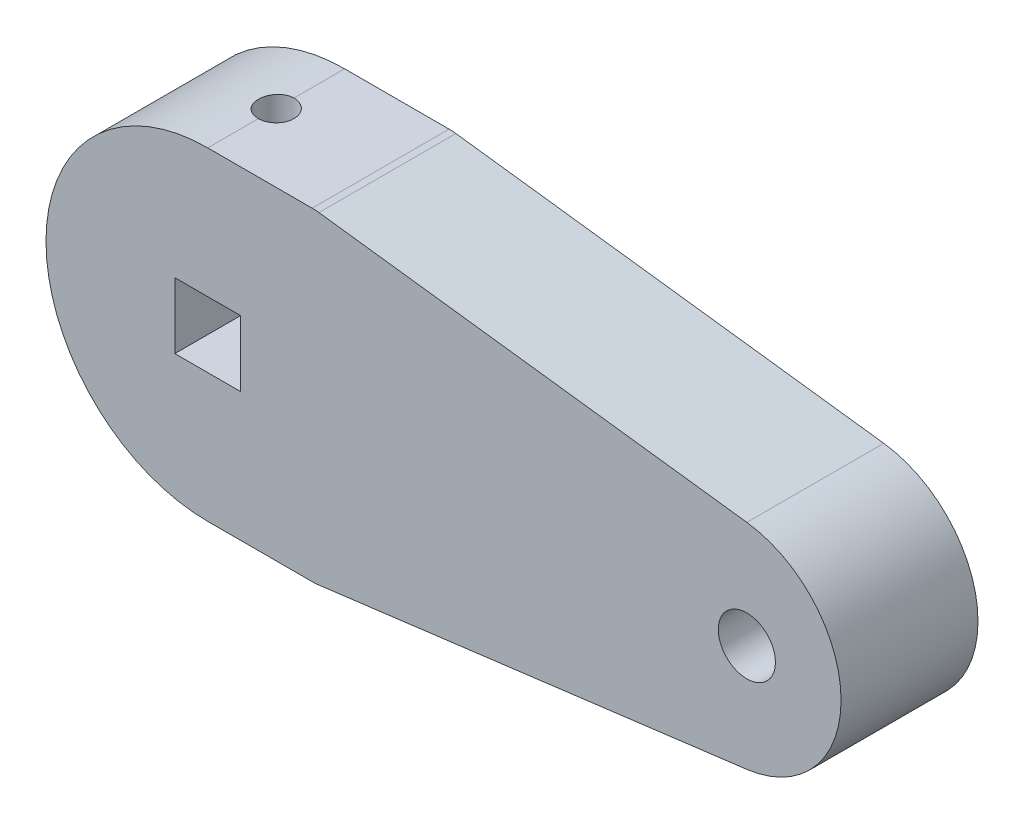
ISO-10303-21;
HEADER;
FILE_DESCRIPTION(('STEP AP214'),'2;1');
FILE_NAME('part.step','',(''),(''),'','','');
FILE_SCHEMA(('AUTOMOTIVE_DESIGN { 1 0 10303 214 1 1 1 1 }'));
ENDSEC;
DATA;
#1=APPLICATION_CONTEXT('core data for automotive mechanical design processes');
#2=APPLICATION_PROTOCOL_DEFINITION('international standard','automotive_design',2000,#1);
#3=PRODUCT_CONTEXT('',#1,'mechanical');
#4=PRODUCT('Part','Part','',(#3));
#5=PRODUCT_RELATED_PRODUCT_CATEGORY('part','',(#4));
#6=PRODUCT_DEFINITION_FORMATION('','',#4);
#7=PRODUCT_DEFINITION_CONTEXT('part definition',#1,'design');
#8=PRODUCT_DEFINITION('design','',#6,#7);
#9=PRODUCT_DEFINITION_SHAPE('','',#8);
#10=(LENGTH_UNIT() NAMED_UNIT(*) SI_UNIT(.MILLI.,.METRE.));
#11=(NAMED_UNIT(*) PLANE_ANGLE_UNIT() SI_UNIT($,.RADIAN.));
#12=(NAMED_UNIT(*) SI_UNIT($,.STERADIAN.) SOLID_ANGLE_UNIT());
#13=UNCERTAINTY_MEASURE_WITH_UNIT(LENGTH_MEASURE(1.E-05),#10,'distance_accuracy_value','');
#14=(GEOMETRIC_REPRESENTATION_CONTEXT(3) GLOBAL_UNCERTAINTY_ASSIGNED_CONTEXT((#13)) GLOBAL_UNIT_ASSIGNED_CONTEXT((#10,
#11,#12)) REPRESENTATION_CONTEXT('',''));
#15=CARTESIAN_POINT('',(0.,0.,0.));
#16=DIRECTION('',(0.,0.,1.));
#17=DIRECTION('',(1.,0.,0.));
#18=AXIS2_PLACEMENT_3D('',#15,#16,#17);
#19=CARTESIAN_POINT('',(10.,15.,12.7));
#20=DIRECTION('',(0.,-1.,0.));
#21=DIRECTION('',(0.,0.,-1.));
#22=AXIS2_PLACEMENT_3D('',#19,#20,#21);
#23=PLANE('',#22);
#24=DIRECTION('',(-1.,0.,0.));
#25=VECTOR('',#24,1.);
#26=CARTESIAN_POINT('',(10.,15.,12.7));
#27=LINE('',#26,#25);
#28=CARTESIAN_POINT('',(9.68379025906273,15.,12.7));
#29=VERTEX_POINT('',#28);
#30=CARTESIAN_POINT('',(0.,15.,12.7));
#31=VERTEX_POINT('',#30);
#32=EDGE_CURVE('E193',#29,#31,#27,.T.);
#33=ORIENTED_EDGE('',*,*,#32,.F.);
#34=DIRECTION('',(0.,0.,-1.));
#35=VECTOR('',#34,1.);
#36=CARTESIAN_POINT('',(9.68379025906273,15.,12.7));
#37=LINE('',#36,#35);
#38=CARTESIAN_POINT('',(9.68379025906273,15.,0.));
#39=VERTEX_POINT('',#38);
#40=EDGE_CURVE('E47',#29,#39,#37,.T.);
#41=ORIENTED_EDGE('',*,*,#40,.T.);
#42=DIRECTION('',(-1.,0.,0.));
#43=VECTOR('',#42,1.);
#44=CARTESIAN_POINT('',(10.,15.,0.));
#45=LINE('',#44,#43);
#46=CARTESIAN_POINT('',(0.,15.,0.));
#47=VERTEX_POINT('',#46);
#48=EDGE_CURVE('E192',#39,#47,#45,.T.);
#49=ORIENTED_EDGE('',*,*,#48,.T.);
#50=DIRECTION('',(0.,0.,-1.));
#51=VECTOR('',#50,1.);
#52=CARTESIAN_POINT('',(0.,15.,12.7));
#53=LINE('',#52,#51);
#54=CARTESIAN_POINT('',(0.,15.,4.7));
#55=VERTEX_POINT('',#54);
#56=EDGE_CURVE('E149',#55,#47,#53,.T.);
#57=ORIENTED_EDGE('',*,*,#56,.F.);
#58=CARTESIAN_POINT('',(0.,15.,6.35));
#59=DIRECTION('',(0.,1.,0.));
#60=DIRECTION('',(0.,0.,1.));
#61=AXIS2_PLACEMENT_3D('',#58,#59,#60);
#62=CIRCLE('',#61,1.65);
#63=CARTESIAN_POINT('',(0.,15.,8.));
#64=VERTEX_POINT('',#63);
#65=EDGE_CURVE('E136',#64,#55,#62,.T.);
#66=ORIENTED_EDGE('',*,*,#65,.F.);
#67=EDGE_CURVE('E147',#31,#64,#53,.T.);
#68=ORIENTED_EDGE('',*,*,#67,.F.);
#69=EDGE_LOOP('',(#33,#41,#49,#57,#66,#68));
#70=FACE_BOUND('',#69,.T.);
#71=ADVANCED_FACE('F38',(#70),#23,.F.);
#72=CARTESIAN_POINT('',(0.,0.,12.7));
#73=DIRECTION('',(0.,0.,1.));
#74=DIRECTION('',(1.,0.,0.));
#75=AXIS2_PLACEMENT_3D('',#72,#73,#74);
#76=PLANE('',#75);
#77=CARTESIAN_POINT('',(50.,0.,12.7));
#78=DIRECTION('',(0.,0.,1.));
#79=DIRECTION('',(1.,0.,0.));
#80=AXIS2_PLACEMENT_3D('',#77,#78,#79);
#81=CIRCLE('',#80,2.65);
#82=CARTESIAN_POINT('',(52.65,0.,12.7));
#83=VERTEX_POINT('',#82);
#84=EDGE_CURVE('E151',#83,#83,#81,.T.);
#85=ORIENTED_EDGE('',*,*,#84,.F.);
#86=EDGE_LOOP('',(#85));
#87=FACE_BOUND('',#86,.T.);
#88=DIRECTION('',(1.,0.,0.));
#89=VECTOR('',#88,1.);
#90=CARTESIAN_POINT('',(10.,-15.,12.7));
#91=LINE('',#90,#89);
#92=CARTESIAN_POINT('',(0.,-15.,12.7));
#93=VERTEX_POINT('',#92);
#94=CARTESIAN_POINT('',(9.68379025906273,-15.,12.7));
#95=VERTEX_POINT('',#94);
#96=EDGE_CURVE('E208',#93,#95,#91,.T.);
#97=ORIENTED_EDGE('',*,*,#96,.T.);
#98=CARTESIAN_POINT('',(9.68379025906273,-10.,12.7));
#99=DIRECTION('',(0.,0.,1.));
#100=DIRECTION('',(1.,0.,0.));
#101=AXIS2_PLACEMENT_3D('',#98,#99,#100);
#102=CIRCLE('',#101,5.);
#103=CARTESIAN_POINT('',(10.3136904274914,-14.960163886185,12.7));
#104=VERTEX_POINT('',#103);
#105=EDGE_CURVE('E186',#95,#104,#102,.T.);
#106=ORIENTED_EDGE('',*,*,#105,.T.);
#107=DIRECTION('',(0.992032777236993,0.125980033685737,0.));
#108=VECTOR('',#107,1.);
#109=CARTESIAN_POINT('',(10.,-15.,12.7));
#110=LINE('',#109,#108);
#111=CARTESIAN_POINT('',(50.,-9.92032777236993,12.7));
#112=VERTEX_POINT('',#111);
#113=EDGE_CURVE('E232',#104,#112,#110,.T.);
#114=ORIENTED_EDGE('',*,*,#113,.T.);
#115=CARTESIAN_POINT('',(48.7401996631426,0.,12.7));
#116=DIRECTION('',(0.,0.,1.));
#117=DIRECTION('',(-1.,0.,0.));
#118=AXIS2_PLACEMENT_3D('',#115,#116,#117);
#119=CIRCLE('',#118,10.);
#120=CARTESIAN_POINT('',(50.,9.92032777236993,12.7));
#121=VERTEX_POINT('',#120);
#122=EDGE_CURVE('E229',#112,#121,#119,.T.);
#123=ORIENTED_EDGE('',*,*,#122,.T.);
#124=DIRECTION('',(-0.992032777236993,0.125980033685737,0.));
#125=VECTOR('',#124,1.);
#126=CARTESIAN_POINT('',(50.,9.92032777236993,12.7));
#127=LINE('',#126,#125);
#128=CARTESIAN_POINT('',(10.3136904274914,14.960163886185,12.7));
#129=VERTEX_POINT('',#128);
#130=EDGE_CURVE('E226',#121,#129,#127,.T.);
#131=ORIENTED_EDGE('',*,*,#130,.T.);
#132=CARTESIAN_POINT('',(9.68379025906273,10.,12.7));
#133=DIRECTION('',(0.,0.,1.));
#134=DIRECTION('',(1.,0.,0.));
#135=AXIS2_PLACEMENT_3D('',#132,#133,#134);
#136=CIRCLE('',#135,5.);
#137=EDGE_CURVE('E54',#129,#29,#136,.T.);
#138=ORIENTED_EDGE('',*,*,#137,.T.);
#139=ORIENTED_EDGE('',*,*,#32,.T.);
#140=CARTESIAN_POINT('',(0.,0.,12.7));
#141=DIRECTION('',(0.,0.,1.));
#142=DIRECTION('',(1.,0.,0.));
#143=AXIS2_PLACEMENT_3D('',#140,#141,#142);
#144=CIRCLE('',#143,15.);
#145=EDGE_CURVE('E155',#31,#93,#144,.T.);
#146=ORIENTED_EDGE('',*,*,#145,.T.);
#147=EDGE_LOOP('',(#97,#106,#114,#123,#131,#138,#139,#146));
#148=FACE_BOUND('',#147,.T.);
#149=DIRECTION('',(1.,0.,0.));
#150=VECTOR('',#149,1.);
#151=CARTESIAN_POINT('',(-3.05,-3.05,12.7));
#152=LINE('',#151,#150);
#153=CARTESIAN_POINT('',(-3.05,-3.05,12.7));
#154=VERTEX_POINT('',#153);
#155=CARTESIAN_POINT('',(3.05,-3.05,12.7));
#156=VERTEX_POINT('',#155);
#157=EDGE_CURVE('E274',#154,#156,#152,.T.);
#158=ORIENTED_EDGE('',*,*,#157,.F.);
#159=DIRECTION('',(0.,-1.,0.));
#160=VECTOR('',#159,1.);
#161=CARTESIAN_POINT('',(-3.05,3.05,12.7));
#162=LINE('',#161,#160);
#163=CARTESIAN_POINT('',(-3.05,3.05,12.7));
#164=VERTEX_POINT('',#163);
#165=EDGE_CURVE('E256',#164,#154,#162,.T.);
#166=ORIENTED_EDGE('',*,*,#165,.F.);
#167=DIRECTION('',(-1.,0.,0.));
#168=VECTOR('',#167,1.);
#169=CARTESIAN_POINT('',(-3.05,3.05,12.7));
#170=LINE('',#169,#168);
#171=CARTESIAN_POINT('',(3.05,3.05,12.7));
#172=VERTEX_POINT('',#171);
#173=EDGE_CURVE('E251',#172,#164,#170,.T.);
#174=ORIENTED_EDGE('',*,*,#173,.F.);
#175=DIRECTION('',(0.,1.,0.));
#176=VECTOR('',#175,1.);
#177=CARTESIAN_POINT('',(3.05,3.05,12.7));
#178=LINE('',#177,#176);
#179=EDGE_CURVE('E270',#156,#172,#178,.T.);
#180=ORIENTED_EDGE('',*,*,#179,.F.);
#181=EDGE_LOOP('',(#158,#166,#174,#180));
#182=FACE_BOUND('',#181,.T.);
#183=ADVANCED_FACE('F310',(#87,#148,#182),#76,.T.);
#184=CARTESIAN_POINT('',(0.,0.,0.));
#185=DIRECTION('',(0.,0.,1.));
#186=DIRECTION('',(1.,0.,0.));
#187=AXIS2_PLACEMENT_3D('',#184,#185,#186);
#188=PLANE('',#187);
#189=CARTESIAN_POINT('',(50.,0.,0.));
#190=DIRECTION('',(0.,0.,-1.));
#191=DIRECTION('',(-1.,0.,0.));
#192=AXIS2_PLACEMENT_3D('',#189,#190,#191);
#193=CIRCLE('',#192,2.65);
#194=CARTESIAN_POINT('',(47.35,0.,0.));
#195=VERTEX_POINT('',#194);
#196=EDGE_CURVE('E370',#195,#195,#193,.T.);
#197=ORIENTED_EDGE('',*,*,#196,.F.);
#198=EDGE_LOOP('',(#197));
#199=FACE_BOUND('',#198,.T.);
#200=DIRECTION('',(0.992032777236993,0.125980033685737,0.));
#201=VECTOR('',#200,1.);
#202=CARTESIAN_POINT('',(10.,-15.,0.));
#203=LINE('',#202,#201);
#204=CARTESIAN_POINT('',(10.3136904274914,-14.960163886185,0.));
#205=VERTEX_POINT('',#204);
#206=CARTESIAN_POINT('',(50.,-9.92032777236993,0.));
#207=VERTEX_POINT('',#206);
#208=EDGE_CURVE('E214',#205,#207,#203,.T.);
#209=ORIENTED_EDGE('',*,*,#208,.F.);
#210=CARTESIAN_POINT('',(9.68379025906273,-10.,0.));
#211=DIRECTION('',(0.,0.,1.));
#212=DIRECTION('',(1.,0.,0.));
#213=AXIS2_PLACEMENT_3D('',#210,#211,#212);
#214=CIRCLE('',#213,5.);
#215=CARTESIAN_POINT('',(9.68379025906273,-15.,0.));
#216=VERTEX_POINT('',#215);
#217=EDGE_CURVE('E178',#205,#216,#214,.F.);
#218=ORIENTED_EDGE('',*,*,#217,.T.);
#219=DIRECTION('',(1.,0.,0.));
#220=VECTOR('',#219,1.);
#221=CARTESIAN_POINT('',(10.,-15.,0.));
#222=LINE('',#221,#220);
#223=CARTESIAN_POINT('',(0.,-15.,0.));
#224=VERTEX_POINT('',#223);
#225=EDGE_CURVE('E217',#224,#216,#222,.T.);
#226=ORIENTED_EDGE('',*,*,#225,.F.);
#227=CARTESIAN_POINT('',(0.,0.,0.));
#228=DIRECTION('',(0.,0.,1.));
#229=DIRECTION('',(1.,0.,0.));
#230=AXIS2_PLACEMENT_3D('',#227,#228,#229);
#231=CIRCLE('',#230,15.);
#232=EDGE_CURVE('E202',#47,#224,#231,.T.);
#233=ORIENTED_EDGE('',*,*,#232,.F.);
#234=ORIENTED_EDGE('',*,*,#48,.F.);
#235=CARTESIAN_POINT('',(9.68379025906273,10.,0.));
#236=DIRECTION('',(0.,0.,1.));
#237=DIRECTION('',(1.,0.,0.));
#238=AXIS2_PLACEMENT_3D('',#235,#236,#237);
#239=CIRCLE('',#238,5.);
#240=CARTESIAN_POINT('',(10.3136904274914,14.960163886185,0.));
#241=VERTEX_POINT('',#240);
#242=EDGE_CURVE('E175',#39,#241,#239,.F.);
#243=ORIENTED_EDGE('',*,*,#242,.T.);
#244=DIRECTION('',(-0.992032777236993,0.125980033685737,0.));
#245=VECTOR('',#244,1.);
#246=CARTESIAN_POINT('',(50.,9.92032777236993,0.));
#247=LINE('',#246,#245);
#248=CARTESIAN_POINT('',(50.,9.92032777236993,0.));
#249=VERTEX_POINT('',#248);
#250=EDGE_CURVE('E204',#249,#241,#247,.T.);
#251=ORIENTED_EDGE('',*,*,#250,.F.);
#252=CARTESIAN_POINT('',(48.7401996631426,0.,0.));
#253=DIRECTION('',(0.,0.,1.));
#254=DIRECTION('',(-1.,0.,0.));
#255=AXIS2_PLACEMENT_3D('',#252,#253,#254);
#256=CIRCLE('',#255,10.);
#257=EDGE_CURVE('E209',#207,#249,#256,.T.);
#258=ORIENTED_EDGE('',*,*,#257,.F.);
#259=EDGE_LOOP('',(#209,#218,#226,#233,#234,#243,#251,#258));
#260=FACE_BOUND('',#259,.T.);
#261=DIRECTION('',(0.,-1.,0.));
#262=VECTOR('',#261,1.);
#263=CARTESIAN_POINT('',(-3.05,3.05,0.));
#264=LINE('',#263,#262);
#265=CARTESIAN_POINT('',(-3.05,3.05,0.));
#266=VERTEX_POINT('',#265);
#267=CARTESIAN_POINT('',(-3.05,-3.05,0.));
#268=VERTEX_POINT('',#267);
#269=EDGE_CURVE('E142',#266,#268,#264,.T.);
#270=ORIENTED_EDGE('',*,*,#269,.T.);
#271=DIRECTION('',(1.,0.,0.));
#272=VECTOR('',#271,1.);
#273=CARTESIAN_POINT('',(-3.05,-3.05,0.));
#274=LINE('',#273,#272);
#275=CARTESIAN_POINT('',(3.05,-3.05,0.));
#276=VERTEX_POINT('',#275);
#277=EDGE_CURVE('E261',#268,#276,#274,.T.);
#278=ORIENTED_EDGE('',*,*,#277,.T.);
#279=DIRECTION('',(0.,1.,0.));
#280=VECTOR('',#279,1.);
#281=CARTESIAN_POINT('',(3.05,3.05,0.));
#282=LINE('',#281,#280);
#283=CARTESIAN_POINT('',(3.05,3.05,0.));
#284=VERTEX_POINT('',#283);
#285=EDGE_CURVE('E257',#276,#284,#282,.T.);
#286=ORIENTED_EDGE('',*,*,#285,.T.);
#287=DIRECTION('',(-1.,0.,0.));
#288=VECTOR('',#287,1.);
#289=CARTESIAN_POINT('',(-3.05,3.05,0.));
#290=LINE('',#289,#288);
#291=EDGE_CURVE('E252',#284,#266,#290,.T.);
#292=ORIENTED_EDGE('',*,*,#291,.T.);
#293=EDGE_LOOP('',(#270,#278,#286,#292));
#294=FACE_BOUND('',#293,.T.);
#295=ADVANCED_FACE('F198',(#199,#260,#294),#188,.F.);
#296=CARTESIAN_POINT('',(10.,-15.,12.7));
#297=DIRECTION('',(0.,1.,0.));
#298=DIRECTION('',(0.,0.,1.));
#299=AXIS2_PLACEMENT_3D('',#296,#297,#298);
#300=PLANE('',#299);
#301=ORIENTED_EDGE('',*,*,#225,.T.);
#302=DIRECTION('',(0.,0.,-1.));
#303=VECTOR('',#302,1.);
#304=CARTESIAN_POINT('',(9.68379025906273,-15.,12.7));
#305=LINE('',#304,#303);
#306=EDGE_CURVE('E181',#216,#95,#305,.F.);
#307=ORIENTED_EDGE('',*,*,#306,.T.);
#308=ORIENTED_EDGE('',*,*,#96,.F.);
#309=DIRECTION('',(0.,0.,-1.));
#310=VECTOR('',#309,1.);
#311=CARTESIAN_POINT('',(0.,-15.,12.7));
#312=LINE('',#311,#310);
#313=EDGE_CURVE('E164',#93,#224,#312,.T.);
#314=ORIENTED_EDGE('',*,*,#313,.T.);
#315=EDGE_LOOP('',(#301,#307,#308,#314));
#316=FACE_BOUND('',#315,.T.);
#317=ADVANCED_FACE('F314',(#316),#300,.F.);
#318=CARTESIAN_POINT('',(10.,-15.,12.7));
#319=DIRECTION('',(-0.125980033685737,0.992032777236993,0.));
#320=DIRECTION('',(-0.992032777236993,-0.125980033685737,0.));
#321=AXIS2_PLACEMENT_3D('',#318,#319,#320);
#322=PLANE('',#321);
#323=ORIENTED_EDGE('',*,*,#113,.F.);
#324=DIRECTION('',(0.,0.,-1.));
#325=VECTOR('',#324,1.);
#326=CARTESIAN_POINT('',(10.3136904274914,-14.960163886185,12.7));
#327=LINE('',#326,#325);
#328=EDGE_CURVE('E171',#104,#205,#327,.T.);
#329=ORIENTED_EDGE('',*,*,#328,.T.);
#330=ORIENTED_EDGE('',*,*,#208,.T.);
#331=DIRECTION('',(0.,0.,-1.));
#332=VECTOR('',#331,1.);
#333=CARTESIAN_POINT('',(50.,-9.92032777236993,12.7));
#334=LINE('',#333,#332);
#335=EDGE_CURVE('E162',#112,#207,#334,.T.);
#336=ORIENTED_EDGE('',*,*,#335,.F.);
#337=EDGE_LOOP('',(#323,#329,#330,#336));
#338=FACE_BOUND('',#337,.T.);
#339=ADVANCED_FACE('F319',(#338),#322,.F.);
#340=CARTESIAN_POINT('',(48.7401996631426,0.,12.7));
#341=DIRECTION('',(0.,0.,-1.));
#342=DIRECTION('',(-1.,0.,0.));
#343=AXIS2_PLACEMENT_3D('',#340,#341,#342);
#344=CYLINDRICAL_SURFACE('',#343,10.);
#345=ORIENTED_EDGE('',*,*,#257,.T.);
#346=DIRECTION('',(0.,0.,-1.));
#347=VECTOR('',#346,1.);
#348=CARTESIAN_POINT('',(50.,9.92032777236993,12.7));
#349=LINE('',#348,#347);
#350=EDGE_CURVE('E157',#121,#249,#349,.T.);
#351=ORIENTED_EDGE('',*,*,#350,.F.);
#352=ORIENTED_EDGE('',*,*,#122,.F.);
#353=ORIENTED_EDGE('',*,*,#335,.T.);
#354=EDGE_LOOP('',(#345,#351,#352,#353));
#355=FACE_BOUND('',#354,.T.);
#356=ADVANCED_FACE('F331',(#355),#344,.T.);
#357=CARTESIAN_POINT('',(50.,9.92032777236993,12.7));
#358=DIRECTION('',(-0.125980033685737,-0.992032777236993,0.));
#359=DIRECTION('',(0.992032777236993,-0.125980033685737,0.));
#360=AXIS2_PLACEMENT_3D('',#357,#358,#359);
#361=PLANE('',#360);
#362=ORIENTED_EDGE('',*,*,#250,.T.);
#363=DIRECTION('',(0.,0.,-1.));
#364=VECTOR('',#363,1.);
#365=CARTESIAN_POINT('',(10.3136904274914,14.960163886185,12.7));
#366=LINE('',#365,#364);
#367=EDGE_CURVE('E11',#241,#129,#366,.F.);
#368=ORIENTED_EDGE('',*,*,#367,.T.);
#369=ORIENTED_EDGE('',*,*,#130,.F.);
#370=ORIENTED_EDGE('',*,*,#350,.T.);
#371=EDGE_LOOP('',(#362,#368,#369,#370));
#372=FACE_BOUND('',#371,.T.);
#373=ADVANCED_FACE('F328',(#372),#361,.F.);
#374=CARTESIAN_POINT('',(0.,0.,12.7));
#375=DIRECTION('',(0.,0.,-1.));
#376=DIRECTION('',(-1.,0.,0.));
#377=AXIS2_PLACEMENT_3D('',#374,#375,#376);
#378=CYLINDRICAL_SURFACE('',#377,15.);
#379=ORIENTED_EDGE('',*,*,#67,.T.);
#380=CARTESIAN_POINT('',(0.,15.,8.));
#381=CARTESIAN_POINT('',(-0.0462726410860465,15.0000011949988,7.99999985676432));
#382=CARTESIAN_POINT('',(-0.0925229794274517,14.9997856134404,7.99805226826382));
#383=CARTESIAN_POINT('',(-0.184690004390084,14.9989335752572,7.99028362718744));
#384=CARTESIAN_POINT('',(-0.230606714109283,14.9982971480548,7.98446284539628));
#385=CARTESIAN_POINT('',(-0.36726476601981,14.9957786592705,7.96125094536174));
#386=CARTESIAN_POINT('',(-0.457086416325034,14.9932872989535,7.93811008915977));
#387=CARTESIAN_POINT('',(-0.631537581781381,14.9869544914111,7.87715840661452));
#388=CARTESIAN_POINT('',(-0.716165213502468,14.9831125578051,7.83934229477651));
#389=CARTESIAN_POINT('',(-0.877876744495593,14.9745080132285,7.75012655559465));
#390=CARTESIAN_POINT('',(-0.954961441952036,14.9697454998318,7.69872836762472));
#391=CARTESIAN_POINT('',(-1.09971485622395,14.9598102180723,7.58357785795002));
#392=CARTESIAN_POINT('',(-1.16734720609647,14.9546359792379,7.51977996335184));
#393=CARTESIAN_POINT('',(-1.29097606008319,14.9444718121714,7.38173013633117));
#394=CARTESIAN_POINT('',(-1.34697078003511,14.9394819122966,7.30747660388023));
#395=CARTESIAN_POINT('',(-1.44585802050676,14.9302369909068,7.15039351239018));
#396=CARTESIAN_POINT('',(-1.48871662936075,14.9259838835564,7.0675424834728));
#397=CARTESIAN_POINT('',(-1.55989650560209,14.9187134338497,6.89576981105262));
#398=CARTESIAN_POINT('',(-1.58821907378605,14.9156959809224,6.80684871155353));
#399=CARTESIAN_POINT('',(-1.62941547549782,14.9112520338773,6.62583679315004));
#400=CARTESIAN_POINT('',(-1.64235132157873,14.9098191551606,6.53376024707061));
#401=CARTESIAN_POINT('',(-1.65259892732556,14.9086868918273,6.34873045749103));
#402=CARTESIAN_POINT('',(-1.64991079805841,14.9089874948877,6.25577722022775));
#403=CARTESIAN_POINT('',(-1.62903723363348,14.9112824541649,6.07206694184326));
#404=CARTESIAN_POINT('',(-1.61092018016101,14.9132693365828,5.98130202447697));
#405=CARTESIAN_POINT('',(-1.55980962924056,14.9187013071225,5.80410928338815));
#406=CARTESIAN_POINT('',(-1.52681596987608,14.9221464111154,5.71768150688229));
#407=CARTESIAN_POINT('',(-1.44681334566139,14.930115289907,5.55139965003435));
#408=CARTESIAN_POINT('',(-1.39977399971692,14.9346413986491,5.47156030333657));
#409=CARTESIAN_POINT('',(-1.29303908773245,14.9442601489022,5.32088689895148));
#410=CARTESIAN_POINT('',(-1.23334362654837,14.9493527857194,5.25005276666374));
#411=CARTESIAN_POINT('',(-1.10261974154845,14.9595635296925,5.11900849989746));
#412=CARTESIAN_POINT('',(-1.03153386077464,14.9646816312297,5.05885567376175));
#413=CARTESIAN_POINT('',(-0.880216051626603,14.9743432738245,4.95130933656259));
#414=CARTESIAN_POINT('',(-0.79998138066312,14.9788866417252,4.90391966597805));
#415=CARTESIAN_POINT('',(-0.63259165753372,14.9868894118781,4.82324759298094));
#416=CARTESIAN_POINT('',(-0.545430989980467,14.9903479230878,4.78997677916137));
#417=CARTESIAN_POINT('',(-0.366778065355925,14.9957801155433,4.73860796800895));
#418=CARTESIAN_POINT('',(-0.275292566347022,14.997756036973,4.72048707448664));
#419=CARTESIAN_POINT('',(-0.152633314243512,14.9992546766234,4.70678814224138));
#420=CARTESIAN_POINT('',(-0.122135836060872,14.9995339956833,4.70424134432647));
#421=CARTESIAN_POINT('',(-0.0610965022046465,14.999906431214,4.70084956401377));
#422=CARTESIAN_POINT('',(-0.0305548066520112,14.9999998590737,4.700001735631));
#423=CARTESIAN_POINT('',(0.,15.,4.7));
#424=B_SPLINE_CURVE_WITH_KNOTS('',3,(#380,#381,#382,#383,#384,#385,#386,#387,#388,#389,#390,
#391,#392,#393,#394,#395,#396,#397,#398,#399,#400,#401,#402,#403,#404,#405,#406,#407,#408,#409,
#410,#411,#412,#413,#414,#415,#416,#417,#418,#419,#420,#421,#422,#423),.UNSPECIFIED.,.F.,.F.,(4,
2,2,2,2,2,2,2,2,2,2,2,2,2,2,2,2,2,2,2,2,4),(0.,0.138732226576484,0.277454755051368,
0.554389268964587,0.831423617352196,1.10842861851773,1.38647164040029,1.66455725759996,
1.94335483770586,2.2221274645104,2.4997727154772,2.77741599273604,3.05383510843748,
3.33025723274797,3.60728164896063,3.88430377011572,4.16277001974359,4.44131996747638,
4.72009810560894,4.99845415868549,5.09023434651916,5.18186066218905),.UNSPECIFIED.);
#425=EDGE_CURVE('E133',#64,#55,#424,.T.);
#426=ORIENTED_EDGE('',*,*,#425,.T.);
#427=ORIENTED_EDGE('',*,*,#56,.T.);
#428=ORIENTED_EDGE('',*,*,#232,.T.);
#429=ORIENTED_EDGE('',*,*,#313,.F.);
#430=ORIENTED_EDGE('',*,*,#145,.F.);
#431=EDGE_LOOP('',(#379,#426,#427,#428,#429,#430));
#432=FACE_BOUND('',#431,.T.);
#433=ADVANCED_FACE('F153',(#432),#378,.T.);
#434=CARTESIAN_POINT('',(-3.05,3.05,12.7));
#435=DIRECTION('',(1.,0.,0.));
#436=DIRECTION('',(0.,0.,-1.));
#437=AXIS2_PLACEMENT_3D('',#434,#435,#436);
#438=PLANE('',#437);
#439=ORIENTED_EDGE('',*,*,#269,.F.);
#440=DIRECTION('',(0.,0.,-1.));
#441=VECTOR('',#440,1.);
#442=CARTESIAN_POINT('',(-3.05,3.05,12.7));
#443=LINE('',#442,#441);
#444=EDGE_CURVE('E247',#164,#266,#443,.T.);
#445=ORIENTED_EDGE('',*,*,#444,.F.);
#446=ORIENTED_EDGE('',*,*,#165,.T.);
#447=DIRECTION('',(0.,0.,-1.));
#448=VECTOR('',#447,1.);
#449=CARTESIAN_POINT('',(-3.05,-3.05,12.7));
#450=LINE('',#449,#448);
#451=EDGE_CURVE('E221',#154,#268,#450,.T.);
#452=ORIENTED_EDGE('',*,*,#451,.T.);
#453=EDGE_LOOP('',(#439,#445,#446,#452));
#454=FACE_BOUND('',#453,.T.);
#455=ADVANCED_FACE('F305',(#454),#438,.T.);
#456=CARTESIAN_POINT('',(-3.05,-3.05,12.7));
#457=DIRECTION('',(0.,1.,0.));
#458=DIRECTION('',(0.,0.,1.));
#459=AXIS2_PLACEMENT_3D('',#456,#457,#458);
#460=PLANE('',#459);
#461=ORIENTED_EDGE('',*,*,#277,.F.);
#462=ORIENTED_EDGE('',*,*,#451,.F.);
#463=ORIENTED_EDGE('',*,*,#157,.T.);
#464=DIRECTION('',(0.,0.,-1.));
#465=VECTOR('',#464,1.);
#466=CARTESIAN_POINT('',(3.05,-3.05,12.7));
#467=LINE('',#466,#465);
#468=EDGE_CURVE('E241',#156,#276,#467,.T.);
#469=ORIENTED_EDGE('',*,*,#468,.T.);
#470=EDGE_LOOP('',(#461,#462,#463,#469));
#471=FACE_BOUND('',#470,.T.);
#472=ADVANCED_FACE('F301',(#471),#460,.T.);
#473=CARTESIAN_POINT('',(3.05,3.05,12.7));
#474=DIRECTION('',(-1.,0.,0.));
#475=DIRECTION('',(0.,-1.,0.));
#476=AXIS2_PLACEMENT_3D('',#473,#474,#475);
#477=PLANE('',#476);
#478=ORIENTED_EDGE('',*,*,#285,.F.);
#479=ORIENTED_EDGE('',*,*,#468,.F.);
#480=ORIENTED_EDGE('',*,*,#179,.T.);
#481=DIRECTION('',(0.,0.,-1.));
#482=VECTOR('',#481,1.);
#483=CARTESIAN_POINT('',(3.05,3.05,12.7));
#484=LINE('',#483,#482);
#485=EDGE_CURVE('E244',#172,#284,#484,.T.);
#486=ORIENTED_EDGE('',*,*,#485,.T.);
#487=EDGE_LOOP('',(#478,#479,#480,#486));
#488=FACE_BOUND('',#487,.T.);
#489=ADVANCED_FACE('F297',(#488),#477,.T.);
#490=CARTESIAN_POINT('',(-3.05,3.05,12.7));
#491=DIRECTION('',(0.,-1.,0.));
#492=DIRECTION('',(0.,0.,-1.));
#493=AXIS2_PLACEMENT_3D('',#490,#491,#492);
#494=PLANE('',#493);
#495=CARTESIAN_POINT('',(0.,3.05,6.35));
#496=DIRECTION('',(0.,-1.,0.));
#497=DIRECTION('',(0.,0.,-1.));
#498=AXIS2_PLACEMENT_3D('',#495,#496,#497);
#499=CIRCLE('',#498,1.65);
#500=CARTESIAN_POINT('',(0.,3.05,4.7));
#501=VERTEX_POINT('',#500);
#502=EDGE_CURVE('E143',#501,#501,#499,.T.);
#503=ORIENTED_EDGE('',*,*,#502,.F.);
#504=EDGE_LOOP('',(#503));
#505=FACE_BOUND('',#504,.T.);
#506=ORIENTED_EDGE('',*,*,#291,.F.);
#507=ORIENTED_EDGE('',*,*,#485,.F.);
#508=ORIENTED_EDGE('',*,*,#173,.T.);
#509=ORIENTED_EDGE('',*,*,#444,.T.);
#510=EDGE_LOOP('',(#506,#507,#508,#509));
#511=FACE_BOUND('',#510,.T.);
#512=ADVANCED_FACE('F293',(#505,#511),#494,.T.);
#513=CARTESIAN_POINT('',(0.,15.,6.35));
#514=DIRECTION('',(0.,1.,0.));
#515=DIRECTION('',(0.,0.,1.));
#516=AXIS2_PLACEMENT_3D('',#513,#514,#515);
#517=CYLINDRICAL_SURFACE('',#516,1.65);
#518=ORIENTED_EDGE('',*,*,#502,.T.);
#519=EDGE_LOOP('',(#518));
#520=FACE_BOUND('',#519,.T.);
#521=ORIENTED_EDGE('',*,*,#65,.T.);
#522=ORIENTED_EDGE('',*,*,#425,.F.);
#523=EDGE_LOOP('',(#521,#522));
#524=FACE_BOUND('',#523,.T.);
#525=ADVANCED_FACE('F135',(#520,#524),#517,.F.);
#526=CARTESIAN_POINT('',(50.,0.,0.));
#527=DIRECTION('',(0.,0.,-1.));
#528=DIRECTION('',(-1.,0.,0.));
#529=AXIS2_PLACEMENT_3D('',#526,#527,#528);
#530=CYLINDRICAL_SURFACE('',#529,2.65);
#531=ORIENTED_EDGE('',*,*,#196,.T.);
#532=EDGE_LOOP('',(#531));
#533=FACE_BOUND('',#532,.T.);
#534=ORIENTED_EDGE('',*,*,#84,.T.);
#535=EDGE_LOOP('',(#534));
#536=FACE_BOUND('',#535,.T.);
#537=ADVANCED_FACE('F292',(#533,#536),#530,.F.);
#538=CARTESIAN_POINT('',(9.68379025906273,-10.,12.7));
#539=DIRECTION('',(0.,0.,-1.));
#540=DIRECTION('',(-1.,0.,0.));
#541=AXIS2_PLACEMENT_3D('',#538,#539,#540);
#542=CYLINDRICAL_SURFACE('',#541,5.);
#543=ORIENTED_EDGE('',*,*,#105,.F.);
#544=ORIENTED_EDGE('',*,*,#306,.F.);
#545=ORIENTED_EDGE('',*,*,#217,.F.);
#546=ORIENTED_EDGE('',*,*,#328,.F.);
#547=EDGE_LOOP('',(#543,#544,#545,#546));
#548=FACE_BOUND('',#547,.T.);
#549=ADVANCED_FACE('F337',(#548),#542,.T.);
#550=CARTESIAN_POINT('',(9.68379025906273,10.,12.7));
#551=DIRECTION('',(0.,0.,-1.));
#552=DIRECTION('',(-1.,0.,0.));
#553=AXIS2_PLACEMENT_3D('',#550,#551,#552);
#554=CYLINDRICAL_SURFACE('',#553,5.);
#555=ORIENTED_EDGE('',*,*,#137,.F.);
#556=ORIENTED_EDGE('',*,*,#367,.F.);
#557=ORIENTED_EDGE('',*,*,#242,.F.);
#558=ORIENTED_EDGE('',*,*,#40,.F.);
#559=EDGE_LOOP('',(#555,#556,#557,#558));
#560=FACE_BOUND('',#559,.T.);
#561=ADVANCED_FACE('F40',(#560),#554,.T.);
#562=CLOSED_SHELL('',(#71,#183,#295,#317,#339,#356,#373,#433,#455,#472,#489,#512,#525,#537,#549,#561));
#563=MANIFOLD_SOLID_BREP('B2',#562);
#564=ADVANCED_BREP_SHAPE_REPRESENTATION('',(#18,#563),#14);
#565=SHAPE_DEFINITION_REPRESENTATION(#9,#564);
ENDSEC;
END-ISO-10303-21;
